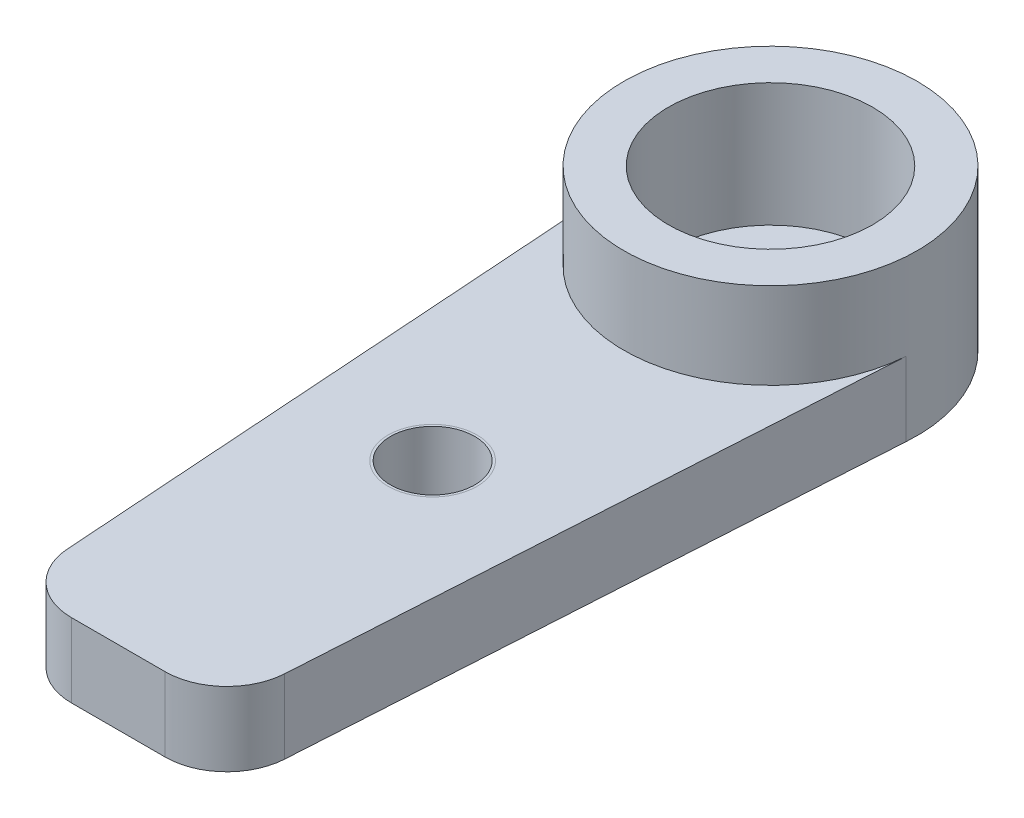
ISO-10303-21;
HEADER;
FILE_DESCRIPTION(('STEP AP214'),'2;1');
FILE_NAME('part.step','',(''),(''),'','','');
FILE_SCHEMA(('AUTOMOTIVE_DESIGN { 1 0 10303 214 1 1 1 1 }'));
ENDSEC;
DATA;
#1=APPLICATION_CONTEXT('core data for automotive mechanical design processes');
#2=APPLICATION_PROTOCOL_DEFINITION('international standard','automotive_design',2000,#1);
#3=PRODUCT_CONTEXT('',#1,'mechanical');
#4=PRODUCT('Part','Part','',(#3));
#5=PRODUCT_RELATED_PRODUCT_CATEGORY('part','',(#4));
#6=PRODUCT_DEFINITION_FORMATION('','',#4);
#7=PRODUCT_DEFINITION_CONTEXT('part definition',#1,'design');
#8=PRODUCT_DEFINITION('design','',#6,#7);
#9=PRODUCT_DEFINITION_SHAPE('','',#8);
#10=(LENGTH_UNIT() NAMED_UNIT(*) SI_UNIT(.MILLI.,.METRE.));
#11=(NAMED_UNIT(*) PLANE_ANGLE_UNIT() SI_UNIT($,.RADIAN.));
#12=(NAMED_UNIT(*) SI_UNIT($,.STERADIAN.) SOLID_ANGLE_UNIT());
#13=UNCERTAINTY_MEASURE_WITH_UNIT(LENGTH_MEASURE(1.E-05),#10,'distance_accuracy_value','');
#14=(GEOMETRIC_REPRESENTATION_CONTEXT(3) GLOBAL_UNCERTAINTY_ASSIGNED_CONTEXT((#13)) GLOBAL_UNIT_ASSIGNED_CONTEXT((#10,
#11,#12)) REPRESENTATION_CONTEXT('',''));
#15=CARTESIAN_POINT('',(0.,0.,0.));
#16=DIRECTION('',(0.,0.,1.));
#17=DIRECTION('',(1.,0.,0.));
#18=AXIS2_PLACEMENT_3D('',#15,#16,#17);
#19=CARTESIAN_POINT('',(39.1996121200788,-327.369804972376,6.04898215260297));
#20=DIRECTION('',(0.,-1.,0.));
#21=DIRECTION('',(0.,0.,-1.));
#22=AXIS2_PLACEMENT_3D('',#19,#20,#21);
#23=CYLINDRICAL_SURFACE('',#22,2.52355760551705);
#24=CARTESIAN_POINT('',(39.1996121200788,-327.369804972376,6.04898215260297));
#25=DIRECTION('',(0.,1.,0.));
#26=DIRECTION('',(1.,0.,0.));
#27=AXIS2_PLACEMENT_3D('',#24,#25,#26);
#28=CIRCLE('',#27,2.52355760551705);
#29=CARTESIAN_POINT('',(41.7231697255958,-327.369804972376,6.04898215260297));
#30=VERTEX_POINT('',#29);
#31=EDGE_CURVE('E153',#30,#30,#28,.T.);
#32=ORIENTED_EDGE('',*,*,#31,.T.);
#33=EDGE_LOOP('',(#32));
#34=FACE_BOUND('',#33,.T.);
#35=CARTESIAN_POINT('',(39.1996121200788,-330.420852972375,6.04898215260296));
#36=DIRECTION('',(0.,-1.,0.));
#37=DIRECTION('',(0.,0.,-1.));
#38=AXIS2_PLACEMENT_3D('',#35,#36,#37);
#39=CIRCLE('',#38,2.52355760551705);
#40=CARTESIAN_POINT('',(39.1996121200788,-330.420852972375,3.52542454708591));
#41=VERTEX_POINT('',#40);
#42=EDGE_CURVE('E53',#41,#41,#39,.T.);
#43=ORIENTED_EDGE('',*,*,#42,.T.);
#44=EDGE_LOOP('',(#43));
#45=FACE_BOUND('',#44,.T.);
#46=ADVANCED_FACE('F49',(#34,#45),#23,.F.);
#47=CARTESIAN_POINT('',(39.1996121200802,-327.369804972375,6.04898215260312));
#48=DIRECTION('',(0.,-1.,0.));
#49=DIRECTION('',(0.,0.,-1.));
#50=AXIS2_PLACEMENT_3D('',#47,#48,#49);
#51=PLANE('',#50);
#52=ORIENTED_EDGE('',*,*,#31,.F.);
#53=EDGE_LOOP('',(#52));
#54=FACE_BOUND('',#53,.T.);
#55=CARTESIAN_POINT('',(39.1996121200802,-327.369804972375,6.04898215260311));
#56=DIRECTION('',(0.,-1.,0.));
#57=DIRECTION('',(0.,0.,-1.));
#58=AXIS2_PLACEMENT_3D('',#55,#56,#57);
#59=CIRCLE('',#58,3.62892633808709);
#60=CARTESIAN_POINT('',(39.1996121200802,-327.369804972375,2.42005581451602));
#61=VERTEX_POINT('',#60);
#62=EDGE_CURVE('E115',#61,#61,#59,.T.);
#63=ORIENTED_EDGE('',*,*,#62,.F.);
#64=EDGE_LOOP('',(#63));
#65=FACE_BOUND('',#64,.T.);
#66=ADVANCED_FACE('F158',(#54,#65),#51,.F.);
#67=CARTESIAN_POINT('',(39.1996121200788,-329.50340497237,14.2271819651617));
#68=DIRECTION('',(0.,-1.,0.));
#69=DIRECTION('',(0.,0.,-1.));
#70=AXIS2_PLACEMENT_3D('',#67,#68,#69);
#71=PLANE('',#70);
#72=CARTESIAN_POINT('',(38.0996121200802,-329.50340497237,14.4055821526031));
#73=CARTESIAN_POINT('',(38.0996109327884,-329.50340497237,14.3881487705209));
#74=CARTESIAN_POINT('',(38.1000109436844,-329.50340497237,14.3707145814438));
#75=CARTESIAN_POINT('',(38.1016211900691,-329.50340497237,14.3360056273951));
#76=CARTESIAN_POINT('',(38.1028257566217,-329.50340497237,14.3187305984356));
#77=CARTESIAN_POINT('',(38.1060448257122,-329.50340497237,14.2843397611255));
#78=CARTESIAN_POINT('',(38.1080554015894,-329.50340497237,14.2672235866262));
#79=CARTESIAN_POINT('',(38.1128843312278,-329.50340497237,14.2331506604044));
#80=CARTESIAN_POINT('',(38.1157005826933,-329.50340497237,14.2161936108827));
#81=CARTESIAN_POINT('',(38.1221390672946,-329.50340497237,14.1824387815991));
#82=CARTESIAN_POINT('',(38.1257610436664,-329.50340497237,14.1656409528717));
#83=CARTESIAN_POINT('',(38.1338092506897,-329.50340497237,14.132204373158));
#84=CARTESIAN_POINT('',(38.1382370429588,-329.50340497237,14.115565998265));
#85=CARTESIAN_POINT('',(38.1478944835488,-329.50340497237,14.0824475626096));
#86=CARTESIAN_POINT('',(38.1531274328146,-329.50340497237,14.0659684646591));
#87=CARTESIAN_POINT('',(38.1643956873405,-329.50340497237,14.0331691094664));
#88=CARTESIAN_POINT('',(38.1704359272859,-329.50340497237,14.0168505508094));
#89=CARTESIAN_POINT('',(38.1838204631289,-329.50340497237,13.9830761120141));
#90=CARTESIAN_POINT('',(38.1912328302821,-329.50340497237,13.9656471745362));
#91=CARTESIAN_POINT('',(38.2068627657328,-329.50340497237,13.9313299401746));
#92=CARTESIAN_POINT('',(38.2150730716787,-329.50340497237,13.9144383382011));
#93=CARTESIAN_POINT('',(38.2322991946132,-329.50340497237,13.8811962763917));
#94=CARTESIAN_POINT('',(38.2413100021961,-329.50340497237,13.8648432227855));
#95=CARTESIAN_POINT('',(38.260134128874,-329.50340497237,13.832677219789));
#96=CARTESIAN_POINT('',(38.2699447319039,-329.50340497237,13.8168626813826));
#97=CARTESIAN_POINT('',(38.2903662819333,-329.50340497237,13.7857726822563));
#98=CARTESIAN_POINT('',(38.300976742761,-329.50340497237,13.7704969022248));
#99=CARTESIAN_POINT('',(38.3229958300074,-329.50340497237,13.7404831924122));
#100=CARTESIAN_POINT('',(38.3344060673546,-329.50340497237,13.7257464447767));
#101=CARTESIAN_POINT('',(38.358022258654,-329.50340497237,13.696808824077));
#102=CARTESIAN_POINT('',(38.3702317197532,-329.50340497237,13.6826108141148));
#103=CARTESIAN_POINT('',(38.395445961595,-329.50340497237,13.6547505941438));
#104=CARTESIAN_POINT('',(38.4084559056191,-329.50340497237,13.6410930618342));
#105=CARTESIAN_POINT('',(38.4351880499014,-329.50340497237,13.6143817333335));
#106=CARTESIAN_POINT('',(38.448912949219,-329.50340497237,13.6013306390967));
#107=CARTESIAN_POINT('',(38.4768873202677,-329.50340497237,13.5760445221078));
#108=CARTESIAN_POINT('',(38.4911314380942,-329.50340497237,13.5638035818023));
#109=CARTESIAN_POINT('',(38.520143837401,-329.50340497237,13.540138131461));
#110=CARTESIAN_POINT('',(38.5349085533762,-329.50340497237,13.5287092528504));
#111=CARTESIAN_POINT('',(38.5649599388324,-329.50340497237,13.5066658373304));
#112=CARTESIAN_POINT('',(38.5802447472109,-329.50340497237,13.4960487639931));
#113=CARTESIAN_POINT('',(38.6113347052217,-329.50340497237,13.4756271589275));
#114=CARTESIAN_POINT('',(38.6271395355331,-329.50340497237,13.4658221411007));
#115=CARTESIAN_POINT('',(38.6592680226993,-329.50340497237,13.4470225923899));
#116=CARTESIAN_POINT('',(38.6755926880767,-329.50340497237,13.4380297854961));
#117=CARTESIAN_POINT('',(38.708759428114,-329.50340497237,13.4208521264038));
#118=CARTESIAN_POINT('',(38.7256035838084,-329.50340497237,13.4126712943663));
#119=CARTESIAN_POINT('',(38.7598087915244,-329.50340497237,13.3971164050289));
#120=CARTESIAN_POINT('',(38.7771727223897,-329.50340497237,13.3897486838337));
#121=CARTESIAN_POINT('',(38.8109380327093,-329.50340497237,13.3763974227537));
#122=CARTESIAN_POINT('',(38.8273148637813,-329.50340497237,13.370351674503));
#123=CARTESIAN_POINT('',(38.86021349044,-329.50340497237,13.3590724093512));
#124=CARTESIAN_POINT('',(38.8767333697244,-329.50340497237,13.3538333130274));
#125=CARTESIAN_POINT('',(38.9099174137878,-329.50340497237,13.3441670813038));
#126=CARTESIAN_POINT('',(38.9265804070002,-329.50340497237,13.33973592657));
#127=CARTESIAN_POINT('',(38.9600498943862,-329.50340497237,13.3316836511385));
#128=CARTESIAN_POINT('',(38.9768558311909,-329.50340497237,13.3280602150809));
#129=CARTESIAN_POINT('',(39.0106106220686,-329.50340497237,13.3216216788229));
#130=CARTESIAN_POINT('',(39.0275593768567,-329.50340497237,13.318806058209));
#131=CARTESIAN_POINT('',(39.0615993612196,-329.50340497237,13.3139814524444));
#132=CARTESIAN_POINT('',(39.0786907777389,-329.50340497237,13.3119737871768));
#133=CARTESIAN_POINT('',(39.1130158530397,-329.50340497237,13.3087627109405));
#134=CARTESIAN_POINT('',(39.1302498064472,-329.50340497237,13.3075624530191));
#135=CARTESIAN_POINT('',(39.1648597991339,-329.50340497237,13.3059663781255));
#136=CARTESIAN_POINT('',(39.1822360644362,-329.50340497237,13.3055755059863));
#137=CARTESIAN_POINT('',(39.2170647926234,-329.50340497237,13.3055888285271));
#138=CARTESIAN_POINT('',(39.2345172536554,-329.50340497237,13.3059965365249));
#139=CARTESIAN_POINT('',(39.269257866268,-329.50340497237,13.3076197567019));
#140=CARTESIAN_POINT('',(39.2865462907721,-329.50340497237,13.3088293819495));
#141=CARTESIAN_POINT('',(39.3209584591156,-329.50340497237,13.3120568225915));
#142=CARTESIAN_POINT('',(39.33808259293,-329.50340497237,13.3140704693784));
#143=CARTESIAN_POINT('',(39.372166115099,-329.50340497237,13.3189036416929));
#144=CARTESIAN_POINT('',(39.3891258374817,-329.50340497237,13.3217208097329));
#145=CARTESIAN_POINT('',(39.4228806390907,-329.50340497237,13.3281592798126));
#146=CARTESIAN_POINT('',(39.4396758175678,-329.50340497237,13.3317800613829));
#147=CARTESIAN_POINT('',(39.4731017104032,-329.50340497237,13.3398240497159));
#148=CARTESIAN_POINT('',(39.4897321128022,-329.50340497237,13.3442485521407));
#149=CARTESIAN_POINT('',(39.5228292356902,-329.50340497237,13.3538974954216));
#150=CARTESIAN_POINT('',(39.5392950701185,-329.50340497237,13.3591249750362));
#151=CARTESIAN_POINT('',(39.572062387547,-329.50340497237,13.3703807086187));
#152=CARTESIAN_POINT('',(39.5883622587664,-329.50340497237,13.3764136458171));
#153=CARTESIAN_POINT('',(39.6221182880985,-329.50340497237,13.3897901756882));
#154=CARTESIAN_POINT('',(39.6395471321508,-329.50340497237,13.397202777423));
#155=CARTESIAN_POINT('',(39.6738642987879,-329.50340497237,13.412832882922));
#156=CARTESIAN_POINT('',(39.6907559254713,-329.50340497237,13.4210431268229));
#157=CARTESIAN_POINT('',(39.7239980052464,-329.50340497237,13.4382692046462));
#158=CARTESIAN_POINT('',(39.7403510522922,-329.50340497237,13.4472800287015));
#159=CARTESIAN_POINT('',(39.7725170505038,-329.50340497237,13.4661041673932));
#160=CARTESIAN_POINT('',(39.7883315906587,-329.50340497237,13.4759147660326));
#161=CARTESIAN_POINT('',(39.8194215910643,-329.50340497237,13.4963363128497));
#162=CARTESIAN_POINT('',(39.8346973706279,-329.50340497237,13.5069467748523));
#163=CARTESIAN_POINT('',(39.8647110800972,-329.50340497237,13.5289658629611));
#164=CARTESIAN_POINT('',(39.8794478278587,-329.50340497237,13.5403760999927));
#165=CARTESIAN_POINT('',(39.9083854486513,-329.50340497237,13.5639922910598));
#166=CARTESIAN_POINT('',(39.9225834585798,-329.50340497237,13.5762017522443));
#167=CARTESIAN_POINT('',(39.9504436785263,-329.50340497237,13.6014159941492));
#168=CARTESIAN_POINT('',(39.9641012108454,-329.50340497237,13.6144259381504));
#169=CARTESIAN_POINT('',(39.9908125393529,-329.50340497237,13.6411580824153));
#170=CARTESIAN_POINT('',(40.0038636335869,-329.50340497237,13.6548829817387));
#171=CARTESIAN_POINT('',(40.0291497505736,-329.50340497237,13.6828573527911));
#172=CARTESIAN_POINT('',(40.0413906908796,-329.50340497237,13.6971014706156));
#173=CARTESIAN_POINT('',(40.065056141221,-329.50340497237,13.7261138699207));
#174=CARTESIAN_POINT('',(40.0764850198313,-329.50340497237,13.7408785858961));
#175=CARTESIAN_POINT('',(40.098528435351,-329.50340497237,13.7709299713524));
#176=CARTESIAN_POINT('',(40.1091455086883,-329.50340497237,13.7862147797307));
#177=CARTESIAN_POINT('',(40.129567113754,-329.50340497237,13.8173047377415));
#178=CARTESIAN_POINT('',(40.1393721315807,-329.50340497237,13.8331095680529));
#179=CARTESIAN_POINT('',(40.1581716802917,-329.50340497237,13.8652380552195));
#180=CARTESIAN_POINT('',(40.1671644871856,-329.50340497237,13.881562720597));
#181=CARTESIAN_POINT('',(40.1843421462783,-329.50340497237,13.9147294606348));
#182=CARTESIAN_POINT('',(40.192522978316,-329.50340497237,13.9315736163296));
#183=CARTESIAN_POINT('',(40.2080778676538,-329.50340497237,13.9657788240464));
#184=CARTESIAN_POINT('',(40.2154455888493,-329.50340497237,13.9831427549121));
#185=CARTESIAN_POINT('',(40.2287968499296,-329.50340497237,14.0169080652322));
#186=CARTESIAN_POINT('',(40.2348425981804,-329.50340497237,14.0332848963042));
#187=CARTESIAN_POINT('',(40.2461218633324,-329.50340497237,14.0661835229628));
#188=CARTESIAN_POINT('',(40.2513609596563,-329.50340497237,14.0827034022472));
#189=CARTESIAN_POINT('',(40.2610271913799,-329.50340497237,14.1158874463105));
#190=CARTESIAN_POINT('',(40.2654583461137,-329.50340497237,14.1325504395229));
#191=CARTESIAN_POINT('',(40.2735106215453,-329.50340497237,14.1660199269089));
#192=CARTESIAN_POINT('',(40.2771340576029,-329.50340497237,14.1828258637136));
#193=CARTESIAN_POINT('',(40.2835725938609,-329.50340497237,14.2165806545913));
#194=CARTESIAN_POINT('',(40.2863882144748,-329.50340497237,14.2335294093794));
#195=CARTESIAN_POINT('',(40.2912128202394,-329.50340497237,14.2675693937423));
#196=CARTESIAN_POINT('',(40.293220485507,-329.50340497237,14.2846608102616));
#197=CARTESIAN_POINT('',(40.2964315617431,-329.50340497237,14.3189858855624));
#198=CARTESIAN_POINT('',(40.2976318196645,-329.50340497237,14.3362198389699));
#199=CARTESIAN_POINT('',(40.2992278945579,-329.50340497237,14.3708298316568));
#200=CARTESIAN_POINT('',(40.2996187666971,-329.50340497237,14.3882060969591));
#201=CARTESIAN_POINT('',(40.2996054441561,-329.50340497237,14.423034825146));
#202=CARTESIAN_POINT('',(40.2991977361582,-329.50340497237,14.4404872861777));
#203=CARTESIAN_POINT('',(40.2975745159812,-329.50340497237,14.4752278987897));
#204=CARTESIAN_POINT('',(40.2963648907334,-329.50340497237,14.4925163232936));
#205=CARTESIAN_POINT('',(40.2931374500914,-329.50340497237,14.5269284916368));
#206=CARTESIAN_POINT('',(40.2911238033044,-329.50340497237,14.544052625451));
#207=CARTESIAN_POINT('',(40.2862906309899,-329.50340497237,14.5781361476198));
#208=CARTESIAN_POINT('',(40.2834734629499,-329.50340497237,14.5950958700024));
#209=CARTESIAN_POINT('',(40.2770349928702,-329.50340497237,14.6288506716115));
#210=CARTESIAN_POINT('',(40.2734142112999,-329.50340497237,14.6456458500887));
#211=CARTESIAN_POINT('',(40.2653702229669,-329.50340497237,14.6790717429242));
#212=CARTESIAN_POINT('',(40.2609457205422,-329.50340497237,14.6957021453234));
#213=CARTESIAN_POINT('',(40.2512967772613,-329.50340497237,14.7287992682116));
#214=CARTESIAN_POINT('',(40.2460692976468,-329.50340497237,14.7452651026402));
#215=CARTESIAN_POINT('',(40.2348135640644,-329.50340497237,14.7780324200693));
#216=CARTESIAN_POINT('',(40.2287806268661,-329.50340497237,14.7943322912889));
#217=CARTESIAN_POINT('',(40.2154040969955,-329.50340497237,14.828088320621));
#218=CARTESIAN_POINT('',(40.2079914952611,-329.50340497237,14.8455171646729));
#219=CARTESIAN_POINT('',(40.1923613897627,-329.50340497237,14.8798343313093));
#220=CARTESIAN_POINT('',(40.1841511458621,-329.50340497237,14.8967259579924));
#221=CARTESIAN_POINT('',(40.1669250680393,-329.50340497237,14.9299680377671));
#222=CARTESIAN_POINT('',(40.157914243984,-329.50340497237,14.9463210848126));
#223=CARTESIAN_POINT('',(40.1390901052926,-329.50340497237,14.978487083024));
#224=CARTESIAN_POINT('',(40.1292795066533,-329.50340497237,14.9943016231789));
#225=CARTESIAN_POINT('',(40.1088579598361,-329.50340497237,15.0253916235845));
#226=CARTESIAN_POINT('',(40.0982474978335,-329.50340497237,15.0406674031482));
#227=CARTESIAN_POINT('',(40.0762284097245,-329.50340497237,15.0706811126177));
#228=CARTESIAN_POINT('',(40.0648181726927,-329.50340497237,15.0854178603793));
#229=CARTESIAN_POINT('',(40.0412019816251,-329.50340497237,15.1143554811724));
#230=CARTESIAN_POINT('',(40.0289925204404,-329.50340497237,15.1285534911012));
#231=CARTESIAN_POINT('',(40.0037782785349,-329.50340497237,15.1564137110484));
#232=CARTESIAN_POINT('',(39.9907683345333,-329.50340497237,15.1700712433679));
#233=CARTESIAN_POINT('',(39.964036190268,-329.50340497237,15.1967825718758));
#234=CARTESIAN_POINT('',(39.9503112909446,-329.50340497237,15.2098336661098));
#235=CARTESIAN_POINT('',(39.9223369198923,-329.50340497237,15.2351197830965));
#236=CARTESIAN_POINT('',(39.9080928020678,-329.50340497237,15.2473607234025));
#237=CARTESIAN_POINT('',(39.8790804027628,-329.50340497237,15.2710261737439));
#238=CARTESIAN_POINT('',(39.8643156867873,-329.50340497237,15.2824550523542));
#239=CARTESIAN_POINT('',(39.8342643013311,-329.50340497237,15.304498467874));
#240=CARTESIAN_POINT('',(39.8189794929528,-329.50340497237,15.3151155412112));
#241=CARTESIAN_POINT('',(39.787889534942,-329.50340497237,15.3355371462769));
#242=CARTESIAN_POINT('',(39.7720847046306,-329.50340497237,15.3453421641036));
#243=CARTESIAN_POINT('',(39.739956217464,-329.50340497237,15.3641417128146));
#244=CARTESIAN_POINT('',(39.7236315520865,-329.50340497237,15.3731345197085));
#245=CARTESIAN_POINT('',(39.6904648120486,-329.50340497237,15.3903121788012));
#246=CARTESIAN_POINT('',(39.6736206563538,-329.50340497237,15.3984930108389));
#247=CARTESIAN_POINT('',(39.639415448637,-329.50340497237,15.4140479001767));
#248=CARTESIAN_POINT('',(39.6220515177712,-329.50340497237,15.4214156213722));
#249=CARTESIAN_POINT('',(39.5882862074513,-329.50340497237,15.4347668824525));
#250=CARTESIAN_POINT('',(39.5719093763795,-329.50340497237,15.4408126307032));
#251=CARTESIAN_POINT('',(39.5390107497212,-329.50340497237,15.4520918958551));
#252=CARTESIAN_POINT('',(39.5224908704368,-329.50340497237,15.4573309921788));
#253=CARTESIAN_POINT('',(39.4893068263737,-329.50340497237,15.4669972239024));
#254=CARTESIAN_POINT('',(39.4726438331614,-329.50340497237,15.4714283786362));
#255=CARTESIAN_POINT('',(39.4391743457754,-329.50340497237,15.4794806540677));
#256=CARTESIAN_POINT('',(39.4223684089708,-329.50340497237,15.4831040901253));
#257=CARTESIAN_POINT('',(39.3886136180931,-329.50340497237,15.4895426263833));
#258=CARTESIAN_POINT('',(39.371664863305,-329.50340497237,15.4923582469972));
#259=CARTESIAN_POINT('',(39.337624878942,-329.50340497237,15.4971828527618));
#260=CARTESIAN_POINT('',(39.3205334624226,-329.50340497237,15.4991905180294));
#261=CARTESIAN_POINT('',(39.2862083871216,-329.50340497237,15.5024015942657));
#262=CARTESIAN_POINT('',(39.268974433714,-329.50340497237,15.5036018521871));
#263=CARTESIAN_POINT('',(39.2343644410268,-329.50340497237,15.5051979270807));
#264=CARTESIAN_POINT('',(39.2169881757244,-329.50340497237,15.50558879922));
#265=CARTESIAN_POINT('',(39.1821594475369,-329.50340497237,15.5055754766791));
#266=CARTESIAN_POINT('',(39.1647069865048,-329.50340497237,15.5051677686813));
#267=CARTESIAN_POINT('',(39.1299663738921,-329.50340497237,15.5035445485043));
#268=CARTESIAN_POINT('',(39.112677949388,-329.50340497237,15.5023349232567));
#269=CARTESIAN_POINT('',(39.0782657810444,-329.50340497237,15.4991074826147));
#270=CARTESIAN_POINT('',(39.06114164723,-329.50340497237,15.4970938358278));
#271=CARTESIAN_POINT('',(39.0270581250609,-329.50340497237,15.4922606635133));
#272=CARTESIAN_POINT('',(39.0100984026782,-329.50340497237,15.4894434954733));
#273=CARTESIAN_POINT('',(38.9763436010691,-329.50340497237,15.4830050253936));
#274=CARTESIAN_POINT('',(38.9595484225921,-329.50340497237,15.4793842438233));
#275=CARTESIAN_POINT('',(38.9261225297567,-329.50340497237,15.4713402554903));
#276=CARTESIAN_POINT('',(38.9094921273577,-329.50340497237,15.4669157530655));
#277=CARTESIAN_POINT('',(38.8763950044699,-329.50340497237,15.4572668097846));
#278=CARTESIAN_POINT('',(38.8599291700416,-329.50340497237,15.45203933017));
#279=CARTESIAN_POINT('',(38.8271618526132,-329.50340497237,15.4407835965875));
#280=CARTESIAN_POINT('',(38.810861981394,-329.50340497237,15.4347506593891));
#281=CARTESIAN_POINT('',(38.7771059520615,-329.50340497237,15.4213741295178));
#282=CARTESIAN_POINT('',(38.7596771080088,-329.50340497237,15.4139615277829));
#283=CARTESIAN_POINT('',(38.7253599413711,-329.50340497237,15.3983314222835));
#284=CARTESIAN_POINT('',(38.7084683146875,-329.50340497237,15.3901211783825));
#285=CARTESIAN_POINT('',(38.675226234912,-329.50340497237,15.3728951005591));
#286=CARTESIAN_POINT('',(38.658873187866,-329.50340497237,15.3638842765036));
#287=CARTESIAN_POINT('',(38.6267071896542,-329.50340497237,15.3450601378119));
#288=CARTESIAN_POINT('',(38.6108926494992,-329.50340497237,15.3352495391725));
#289=CARTESIAN_POINT('',(38.5798026490937,-329.50340497237,15.3148279923553));
#290=CARTESIAN_POINT('',(38.5645268695303,-329.50340497237,15.3042175303527));
#291=CARTESIAN_POINT('',(38.5345131600608,-329.50340497237,15.2821984422441));
#292=CARTESIAN_POINT('',(38.5197764122991,-329.50340497237,15.2707882052128));
#293=CARTESIAN_POINT('',(38.4908387915081,-329.50340497237,15.2471720141454));
#294=CARTESIAN_POINT('',(38.4766407815815,-329.50340497237,15.2349625529604));
#295=CARTESIAN_POINT('',(38.4487805616311,-329.50340497237,15.2097483110575));
#296=CARTESIAN_POINT('',(38.4351230293062,-329.50340497237,15.196738367059));
#297=CARTESIAN_POINT('',(38.4084117008156,-329.50340497237,15.1700062227871));
#298=CARTESIAN_POINT('',(38.3953606066044,-329.50340497237,15.1562813234541));
#299=CARTESIAN_POINT('',(38.3700744895547,-329.50340497237,15.1283069524258));
#300=CARTESIAN_POINT('',(38.3578335491639,-329.50340497237,15.1140628346346));
#301=CARTESIAN_POINT('',(38.3341680990531,-329.50340497237,15.0850504352374));
#302=CARTESIAN_POINT('',(38.322739220756,-329.50340497237,15.0702857191373));
#303=CARTESIAN_POINT('',(38.3006958043807,-329.50340497237,15.0402343340205));
#304=CARTESIAN_POINT('',(38.2900787298795,-329.50340497237,15.0249495261041));
#305=CARTESIAN_POINT('',(38.2696571279946,-329.50340497237,14.9938595668306));
#306=CARTESIAN_POINT('',(38.2598521145091,-329.50340497237,14.9780547347959));
#307=CARTESIAN_POINT('',(38.2410525539238,-329.50340497237,14.9459262523435));
#308=CARTESIAN_POINT('',(38.2320597307717,-329.50340497237,14.9296015934205));
#309=CARTESIAN_POINT('',(38.2148821161876,-329.50340497237,14.896434835714));
#310=CARTESIAN_POINT('',(38.2067013452812,-329.50340497237,14.8795906557515));
#311=CARTESIAN_POINT('',(38.1911462884583,-329.50340497237,14.8453855145246));
#312=CARTESIAN_POINT('',(38.1837783365247,-329.50340497237,14.8280216752589));
#313=CARTESIAN_POINT('',(38.1704350402147,-329.50340497237,14.7942747352386));
#314=CARTESIAN_POINT('',(38.1643965559165,-329.50340497237,14.7779165506603));
#315=CARTESIAN_POINT('',(38.1531297485045,-329.50340497237,14.745049889709));
#316=CARTESIAN_POINT('',(38.1478960934632,-329.50340497237,14.7285432443568));
#317=CARTESIAN_POINT('',(38.1382383183738,-329.50340497237,14.6953804659585));
#318=CARTESIAN_POINT('',(38.1338104394294,-329.50340497237,14.6787254282174));
#319=CARTESIAN_POINT('',(38.1257623552459,-329.50340497237,14.6452666010829));
#320=CARTESIAN_POINT('',(38.1221400995145,-329.50340497237,14.628463305186));
#321=CARTESIAN_POINT('',(38.1157016018877,-329.50340497237,14.594708550704));
#322=CARTESIAN_POINT('',(38.1128851033119,-329.50340497237,14.5777571410791));
#323=CARTESIAN_POINT('',(38.1080561855005,-329.50340497237,14.5437065509498));
#324=CARTESIAN_POINT('',(38.1060453422567,-329.50340497237,14.5266071470181));
#325=CARTESIAN_POINT('',(38.1028262748225,-329.50340497237,14.4922609140716));
#326=CARTESIAN_POINT('',(38.1016214498482,-329.50340497237,14.4750137675399));
#327=CARTESIAN_POINT('',(38.1000111933788,-329.50340497237,14.4403717157059));
#328=CARTESIAN_POINT('',(38.0996109148241,-329.50340497237,14.4229765700722));
#329=CARTESIAN_POINT('',(38.0996121200802,-329.50340497237,14.4055821526031));
#330=B_SPLINE_CURVE_WITH_KNOTS('',3,(#72,#73,#74,#75,#76,#77,#78,#79,#80,#81,#82,#83,#84,#85,
#86,#87,#88,#89,#90,#91,#92,#93,#94,#95,#96,#97,#98,#99,#100,#101,#102,#103,#104,#105,#106,#107,
#108,#109,#110,#111,#112,#113,#114,#115,#116,#117,#118,#119,#120,#121,#122,#123,#124,#125,#126,
#127,#128,#129,#130,#131,#132,#133,#134,#135,#136,#137,#138,#139,#140,#141,#142,#143,#144,#145,
#146,#147,#148,#149,#150,#151,#152,#153,#154,#155,#156,#157,#158,#159,#160,#161,#162,#163,#164,
#165,#166,#167,#168,#169,#170,#171,#172,#173,#174,#175,#176,#177,#178,#179,#180,#181,#182,#183,
#184,#185,#186,#187,#188,#189,#190,#191,#192,#193,#194,#195,#196,#197,#198,#199,#200,#201,#202,
#203,#204,#205,#206,#207,#208,#209,#210,#211,#212,#213,#214,#215,#216,#217,#218,#219,#220,#221,
#222,#223,#224,#225,#226,#227,#228,#229,#230,#231,#232,#233,#234,#235,#236,#237,#238,#239,#240,
#241,#242,#243,#244,#245,#246,#247,#248,#249,#250,#251,#252,#253,#254,#255,#256,#257,#258,#259,
#260,#261,#262,#263,#264,#265,#266,#267,#268,#269,#270,#271,#272,#273,#274,#275,#276,#277,#278,
#279,#280,#281,#282,#283,#284,#285,#286,#287,#288,#289,#290,#291,#292,#293,#294,#295,#296,#297,
#298,#299,#300,#301,#302,#303,#304,#305,#306,#307,#308,#309,#310,#311,#312,#313,#314,#315,#316,
#317,#318,#319,#320,#321,#322,#323,#324,#325,#326,#327,#328,#329),.UNSPECIFIED.,.F.,.F.,(4,2,2,
2,2,2,2,2,2,2,2,2,2,2,2,2,2,2,2,2,2,2,2,2,2,2,2,2,2,2,2,2,2,2,2,2,2,2,2,2,2,2,2,2,2,2,2,2,2,2,2,
2,2,2,2,2,2,2,2,2,2,2,2,2,2,2,2,2,2,2,2,2,2,2,2,2,2,2,2,2,2,2,2,2,2,2,2,2,2,2,2,2,2,2,2,2,2,2,2,
2,2,2,2,2,2,2,2,2,2,2,2,2,2,2,2,2,2,2,2,2,2,2,2,2,2,2,2,2,4),(0.,0.0522966891070737,
0.104228726834629,0.155910781841791,0.20745919106305,0.258991196583642,0.310624152231737,
0.3624747263963,0.414658127873047,0.471453333292767,0.527772947069813,0.583762079984033,
0.63956842087949,0.695341110746102,0.751229559972549,0.807382254921948,0.863945600954396,
0.920740623791906,0.97706014357761,1.0330492424125,1.08885557948514,1.14462826559814,
1.20051668089794,1.25666928193173,1.31323244512711,1.3655856836601,1.41755874518485,
1.46926574343294,1.5208225588467,1.57234608519727,1.62395344246147,1.67576118207824,
1.72788451129669,1.78023766988183,1.83221069410763,1.88391768205827,1.93547449810706,
1.98699801974202,2.03860535066174,2.09041302625197,2.14253623814342,2.1993314435621,
2.25565105733841,2.31164019025219,2.3674465311475,2.42321922101425,2.47910767024112,
2.53526036519122,2.59182371122464,2.64861873406055,2.70493825384511,2.7609273526793,
2.81673368975171,2.87250637586494,2.92839479116545,2.9845473922004,3.0411105553974,
3.09346379393037,3.14543685545511,3.19714385370319,3.24870066911694,3.30022419546752,
3.35183155273175,3.40363929234858,3.45576262156711,3.5081157801513,3.56008880437645,
3.61179579232668,3.66335260837535,3.71487613001043,3.76648346093053,3.81829113652135,
3.87041434841361,3.92720955383073,3.9835291676059,4.03951830051899,4.09532464141407,
4.15109733128106,4.20698578050864,4.26313847545993,4.31970182149501,4.37649684433087,
4.43281636411538,4.48880546294955,4.54461180002196,4.60038448613519,4.65627290143572,
4.71242550247072,4.76898866566779,4.82134190420023,4.87331496572459,4.92502196397244,
4.97657877938611,5.02810230573676,5.07970966300121,5.13151740261841,5.18364073183744,
5.2359938904228,5.28796691464877,5.33967390259949,5.39123071864833,5.44275424028325,
5.49436157120288,5.54616924679295,5.59829245868419,5.65508766410409,5.71140727788126,
5.76739641079556,5.82320275169104,5.87897544155762,5.93486389078399,5.99101658573325,
6.0475799317655,6.1043749546029,6.16069447438853,6.21668357322338,6.272489910296,
6.32826259640902,6.38415101170887,6.44030361274273,6.49686677593821,6.54915998182426,
6.60109025529089,6.65277169348913,6.70432004591288,6.75585195886409,6.80748419006382,
6.85933281951877,6.91151248304293),.UNSPECIFIED.);
#331=CARTESIAN_POINT('',(38.0996121200802,-329.50340497237,14.4055821526031));
#332=VERTEX_POINT('',#331);
#333=EDGE_CURVE('E189',#332,#332,#330,.T.);
#334=ORIENTED_EDGE('',*,*,#333,.T.);
#335=EDGE_LOOP('',(#334));
#336=FACE_BOUND('',#335,.T.);
#337=DIRECTION('',(0.0684059350238423,0.,0.997657570538867));
#338=VECTOR('',#337,1.);
#339=CARTESIAN_POINT('',(35.5748012681271,-329.50340497237,6.22176136094463));
#340=LINE('',#339,#338);
#341=CARTESIAN_POINT('',(36.5752620582078,-329.50340497237,20.8128532143551));
#342=VERTEX_POINT('',#341);
#343=CARTESIAN_POINT('',(35.5851420688733,-329.50340497237,6.37257544083807));
#344=VERTEX_POINT('',#343);
#345=EDGE_CURVE('E107',#342,#344,#340,.F.);
#346=ORIENTED_EDGE('',*,*,#345,.F.);
#347=CARTESIAN_POINT('',(38.0956921957091,-329.50340497237,20.7086025693787));
#348=DIRECTION('',(0.,1.,0.));
#349=DIRECTION('',(0.,0.,1.));
#350=AXIS2_PLACEMENT_3D('',#347,#348,#349);
#351=CIRCLE('',#350,1.52400000000003);
#352=CARTESIAN_POINT('',(38.0956921957091,-329.50340497237,22.2326025693787));
#353=VERTEX_POINT('',#352);
#354=EDGE_CURVE('E124',#353,#342,#351,.F.);
#355=ORIENTED_EDGE('',*,*,#354,.F.);
#356=DIRECTION('',(1.,0.,0.));
#357=VECTOR('',#356,1.);
#358=CARTESIAN_POINT('',(38.0956921957091,-329.50340497237,22.2326025693787));
#359=LINE('',#358,#357);
#360=CARTESIAN_POINT('',(40.4130280551528,-329.50340497237,22.2326025693787));
#361=VERTEX_POINT('',#360);
#362=EDGE_CURVE('E141',#361,#353,#359,.F.);
#363=ORIENTED_EDGE('',*,*,#362,.F.);
#364=CARTESIAN_POINT('',(40.4130280551528,-329.50340497237,20.7086025693787));
#365=DIRECTION('',(0.,1.,0.));
#366=DIRECTION('',(0.,0.,1.));
#367=AXIS2_PLACEMENT_3D('',#364,#365,#366);
#368=CIRCLE('',#367,1.52400000000004);
#369=CARTESIAN_POINT('',(41.9341950551768,-329.50340497237,20.8014839886074));
#370=VERTEX_POINT('',#369);
#371=EDGE_CURVE('E224',#370,#361,#368,.F.);
#372=ORIENTED_EDGE('',*,*,#371,.F.);
#373=DIRECTION('',(0.0609458131421778,0.,-0.998141076131244));
#374=VECTOR('',#373,1.);
#375=CARTESIAN_POINT('',(41.9341950551768,-329.50340497237,20.8014839886074));
#376=LINE('',#375,#374);
#377=CARTESIAN_POINT('',(42.8185162232784,-329.50340497237,6.31849923762289));
#378=VERTEX_POINT('',#377);
#379=EDGE_CURVE('E109',#378,#370,#376,.F.);
#380=ORIENTED_EDGE('',*,*,#379,.F.);
#381=CARTESIAN_POINT('',(39.1996121200802,-329.50340497237,6.0489821526031));
#382=DIRECTION('',(0.,-1.,0.));
#383=DIRECTION('',(0.,0.,-1.));
#384=AXIS2_PLACEMENT_3D('',#381,#382,#383);
#385=CIRCLE('',#384,3.62892633808709);
#386=EDGE_CURVE('E102',#344,#378,#385,.F.);
#387=ORIENTED_EDGE('',*,*,#386,.F.);
#388=EDGE_LOOP('',(#346,#355,#363,#372,#380,#387));
#389=FACE_BOUND('',#388,.T.);
#390=ADVANCED_FACE('F104',(#336,#389),#71,.F.);
#391=CARTESIAN_POINT('',(39.1996121200802,-329.503204972375,14.4055821526031));
#392=DIRECTION('',(0.,-1.,0.));
#393=DIRECTION('',(0.,0.,-1.));
#394=AXIS2_PLACEMENT_3D('',#391,#392,#393);
#395=PLANE('',#394);
#396=CARTESIAN_POINT('',(39.1996121200801,-329.503204972375,14.4055821526031));
#397=DIRECTION('',(0.,-1.,0.));
#398=DIRECTION('',(0.,0.,-1.));
#399=AXIS2_PLACEMENT_3D('',#396,#397,#398);
#400=CIRCLE('',#399,1.0414);
#401=CARTESIAN_POINT('',(39.1996121200801,-329.503204972375,13.3641821526031));
#402=VERTEX_POINT('',#401);
#403=EDGE_CURVE('E195',#402,#402,#400,.T.);
#404=ORIENTED_EDGE('',*,*,#403,.T.);
#405=EDGE_LOOP('',(#404));
#406=FACE_BOUND('',#405,.T.);
#407=ORIENTED_EDGE('',*,*,#333,.F.);
#408=EDGE_LOOP('',(#407));
#409=FACE_BOUND('',#408,.T.);
#410=ADVANCED_FACE('F169',(#406,#409),#395,.F.);
#411=CARTESIAN_POINT('',(39.1996121200802,-330.420852972375,6.0489821526031));
#412=DIRECTION('',(0.,-1.,0.));
#413=DIRECTION('',(0.,0.,-1.));
#414=AXIS2_PLACEMENT_3D('',#411,#412,#413);
#415=PLANE('',#414);
#416=CARTESIAN_POINT('',(39.1996121200802,-330.420852972375,6.0489821526031));
#417=DIRECTION('',(0.,-1.,0.));
#418=DIRECTION('',(0.,0.,-1.));
#419=AXIS2_PLACEMENT_3D('',#416,#417,#418);
#420=CIRCLE('',#419,1.33598684819257);
#421=CARTESIAN_POINT('',(39.1996121200802,-330.420852972375,4.71299530441053));
#422=VERTEX_POINT('',#421);
#423=EDGE_CURVE('E128',#422,#422,#420,.T.);
#424=ORIENTED_EDGE('',*,*,#423,.T.);
#425=EDGE_LOOP('',(#424));
#426=FACE_BOUND('',#425,.T.);
#427=ORIENTED_EDGE('',*,*,#42,.F.);
#428=EDGE_LOOP('',(#427));
#429=FACE_BOUND('',#428,.T.);
#430=ADVANCED_FACE('F174',(#426,#429),#415,.F.);
#431=CARTESIAN_POINT('',(39.1996121200802,-330.417804972375,6.0489821526031));
#432=DIRECTION('',(0.,-1.,0.));
#433=DIRECTION('',(0.,0.,-1.));
#434=AXIS2_PLACEMENT_3D('',#431,#432,#433);
#435=CYLINDRICAL_SURFACE('',#434,3.62892633808709);
#436=ORIENTED_EDGE('',*,*,#62,.T.);
#437=EDGE_LOOP('',(#436));
#438=FACE_BOUND('',#437,.T.);
#439=DIRECTION('',(0.,1.,0.));
#440=VECTOR('',#439,1.);
#441=CARTESIAN_POINT('',(35.5851420688733,-331.33220497237,6.37257544083871));
#442=LINE('',#441,#440);
#443=CARTESIAN_POINT('',(35.5851420688732,-331.332204972375,6.37257544083697));
#444=VERTEX_POINT('',#443);
#445=EDGE_CURVE('E118',#344,#444,#442,.F.);
#446=ORIENTED_EDGE('',*,*,#445,.F.);
#447=ORIENTED_EDGE('',*,*,#386,.T.);
#448=DIRECTION('',(0.,1.,0.));
#449=VECTOR('',#448,1.);
#450=CARTESIAN_POINT('',(42.8185162232785,-331.33220497237,6.31849923762097));
#451=LINE('',#450,#449);
#452=CARTESIAN_POINT('',(42.8185162232785,-331.332204972372,6.31849923762163));
#453=VERTEX_POINT('',#452);
#454=EDGE_CURVE('E114',#453,#378,#451,.T.);
#455=ORIENTED_EDGE('',*,*,#454,.F.);
#456=CARTESIAN_POINT('',(39.1996121200802,-331.332204972375,6.0489821526031));
#457=DIRECTION('',(0.,-1.,0.));
#458=DIRECTION('',(0.,0.,-1.));
#459=AXIS2_PLACEMENT_3D('',#456,#457,#458);
#460=CIRCLE('',#459,3.62892633808709);
#461=EDGE_CURVE('E120',#444,#453,#460,.T.);
#462=ORIENTED_EDGE('',*,*,#461,.F.);
#463=EDGE_LOOP('',(#446,#447,#455,#462));
#464=FACE_BOUND('',#463,.T.);
#465=ADVANCED_FACE('F119',(#438,#464),#435,.T.);
#466=CARTESIAN_POINT('',(41.9341950551768,-331.33220497237,20.8014839886074));
#467=DIRECTION('',(0.998141076131244,0.,0.0609458131421778));
#468=DIRECTION('',(0.0609458131421778,0.,-0.998141076131244));
#469=AXIS2_PLACEMENT_3D('',#466,#467,#468);
#470=PLANE('',#469);
#471=DIRECTION('',(0.,1.,0.));
#472=VECTOR('',#471,1.);
#473=CARTESIAN_POINT('',(41.9341950551769,-331.33220497237,20.8014839886074));
#474=LINE('',#473,#472);
#475=CARTESIAN_POINT('',(41.9341950551768,-331.332204972372,20.8014839886074));
#476=VERTEX_POINT('',#475);
#477=EDGE_CURVE('E148',#476,#370,#474,.T.);
#478=ORIENTED_EDGE('',*,*,#477,.F.);
#479=DIRECTION('',(-0.0609458131421805,0.,0.998141076131244));
#480=VECTOR('',#479,1.);
#481=CARTESIAN_POINT('',(42.8185162232785,-331.332204972375,6.31849923762097));
#482=LINE('',#481,#480);
#483=EDGE_CURVE('E214',#453,#476,#482,.T.);
#484=ORIENTED_EDGE('',*,*,#483,.F.);
#485=ORIENTED_EDGE('',*,*,#454,.T.);
#486=ORIENTED_EDGE('',*,*,#379,.T.);
#487=EDGE_LOOP('',(#478,#484,#485,#486));
#488=FACE_BOUND('',#487,.T.);
#489=ADVANCED_FACE('F230',(#488),#470,.T.);
#490=CARTESIAN_POINT('',(40.4130280551528,-331.33220497237,20.7086025693787));
#491=DIRECTION('',(0.,1.,0.));
#492=DIRECTION('',(0.,0.,1.));
#493=AXIS2_PLACEMENT_3D('',#490,#491,#492);
#494=CYLINDRICAL_SURFACE('',#493,1.52400000000004);
#495=ORIENTED_EDGE('',*,*,#371,.T.);
#496=DIRECTION('',(0.,-1.,0.));
#497=VECTOR('',#496,1.);
#498=CARTESIAN_POINT('',(40.4130280551528,-331.33220497237,22.2326025693787));
#499=LINE('',#498,#497);
#500=CARTESIAN_POINT('',(40.4130280551528,-331.332204972372,22.2326025693787));
#501=VERTEX_POINT('',#500);
#502=EDGE_CURVE('E145',#501,#361,#499,.F.);
#503=ORIENTED_EDGE('',*,*,#502,.F.);
#504=CARTESIAN_POINT('',(40.4130280551528,-331.33220497237,20.7086025693787));
#505=DIRECTION('',(0.,1.,0.));
#506=DIRECTION('',(0.,0.,1.));
#507=AXIS2_PLACEMENT_3D('',#504,#505,#506);
#508=CIRCLE('',#507,1.52400000000004);
#509=EDGE_CURVE('E213',#476,#501,#508,.F.);
#510=ORIENTED_EDGE('',*,*,#509,.F.);
#511=ORIENTED_EDGE('',*,*,#477,.T.);
#512=EDGE_LOOP('',(#495,#503,#510,#511));
#513=FACE_BOUND('',#512,.T.);
#514=ADVANCED_FACE('F256',(#513),#494,.T.);
#515=CARTESIAN_POINT('',(38.0956921957091,-331.33220497237,22.2326025693787));
#516=DIRECTION('',(0.,0.,1.));
#517=DIRECTION('',(0.,-1.,0.));
#518=AXIS2_PLACEMENT_3D('',#515,#516,#517);
#519=PLANE('',#518);
#520=ORIENTED_EDGE('',*,*,#362,.T.);
#521=DIRECTION('',(0.,1.,0.));
#522=VECTOR('',#521,1.);
#523=CARTESIAN_POINT('',(38.0956921957091,-331.33220497237,22.2326025693787));
#524=LINE('',#523,#522);
#525=CARTESIAN_POINT('',(38.0956921957091,-331.332204972372,22.2326025693787));
#526=VERTEX_POINT('',#525);
#527=EDGE_CURVE('E144',#526,#353,#524,.T.);
#528=ORIENTED_EDGE('',*,*,#527,.F.);
#529=DIRECTION('',(1.,0.,0.));
#530=VECTOR('',#529,1.);
#531=CARTESIAN_POINT('',(39.1996121200802,-331.332204972375,22.2326025693787));
#532=LINE('',#531,#530);
#533=EDGE_CURVE('E209',#501,#526,#532,.F.);
#534=ORIENTED_EDGE('',*,*,#533,.F.);
#535=ORIENTED_EDGE('',*,*,#502,.T.);
#536=EDGE_LOOP('',(#520,#528,#534,#535));
#537=FACE_BOUND('',#536,.T.);
#538=ADVANCED_FACE('F279',(#537),#519,.T.);
#539=CARTESIAN_POINT('',(38.0956921957091,-331.33220497237,20.7086025693787));
#540=DIRECTION('',(0.,1.,0.));
#541=DIRECTION('',(0.,0.,1.));
#542=AXIS2_PLACEMENT_3D('',#539,#540,#541);
#543=CYLINDRICAL_SURFACE('',#542,1.52400000000003);
#544=ORIENTED_EDGE('',*,*,#354,.T.);
#545=DIRECTION('',(0.,1.,0.));
#546=VECTOR('',#545,1.);
#547=CARTESIAN_POINT('',(36.5752620582078,-331.33220497237,20.8128532143551));
#548=LINE('',#547,#546);
#549=CARTESIAN_POINT('',(36.5752620582078,-331.332204972372,20.8128532143551));
#550=VERTEX_POINT('',#549);
#551=EDGE_CURVE('E69',#550,#342,#548,.T.);
#552=ORIENTED_EDGE('',*,*,#551,.F.);
#553=CARTESIAN_POINT('',(38.0956921957091,-331.33220497237,20.7086025693787));
#554=DIRECTION('',(0.,1.,0.));
#555=DIRECTION('',(0.,0.,1.));
#556=AXIS2_PLACEMENT_3D('',#553,#554,#555);
#557=CIRCLE('',#556,1.52400000000003);
#558=EDGE_CURVE('E208',#526,#550,#557,.F.);
#559=ORIENTED_EDGE('',*,*,#558,.F.);
#560=ORIENTED_EDGE('',*,*,#527,.T.);
#561=EDGE_LOOP('',(#544,#552,#559,#560));
#562=FACE_BOUND('',#561,.T.);
#563=ADVANCED_FACE('F276',(#562),#543,.T.);
#564=CARTESIAN_POINT('',(35.5748012681271,-331.33220497237,6.22176136094463));
#565=DIRECTION('',(-0.997657570538867,0.,0.0684059350238423));
#566=DIRECTION('',(0.0684059350238423,0.,0.997657570538867));
#567=AXIS2_PLACEMENT_3D('',#564,#565,#566);
#568=PLANE('',#567);
#569=ORIENTED_EDGE('',*,*,#551,.T.);
#570=ORIENTED_EDGE('',*,*,#345,.T.);
#571=ORIENTED_EDGE('',*,*,#445,.T.);
#572=DIRECTION('',(-0.0684059350238439,0.,-0.997657570538867));
#573=VECTOR('',#572,1.);
#574=CARTESIAN_POINT('',(36.5752620582078,-331.332204972375,20.8128532143551));
#575=LINE('',#574,#573);
#576=EDGE_CURVE('E60',#550,#444,#575,.T.);
#577=ORIENTED_EDGE('',*,*,#576,.F.);
#578=EDGE_LOOP('',(#569,#570,#571,#577));
#579=FACE_BOUND('',#578,.T.);
#580=ADVANCED_FACE('F126',(#579),#568,.T.);
#581=CARTESIAN_POINT('',(39.1996121200802,-330.417804972375,6.0489821526031));
#582=DIRECTION('',(0.,-1.,0.));
#583=DIRECTION('',(0.,0.,-1.));
#584=AXIS2_PLACEMENT_3D('',#581,#582,#583);
#585=CYLINDRICAL_SURFACE('',#584,1.33598684819257);
#586=CARTESIAN_POINT('',(39.1996121200802,-331.332204972375,6.0489821526031));
#587=DIRECTION('',(0.,-1.,0.));
#588=DIRECTION('',(0.,0.,-1.));
#589=AXIS2_PLACEMENT_3D('',#586,#587,#588);
#590=CIRCLE('',#589,1.33598684819257);
#591=CARTESIAN_POINT('',(39.1996121200802,-331.332204972375,4.71299530441053));
#592=VERTEX_POINT('',#591);
#593=EDGE_CURVE('E11',#592,#592,#590,.F.);
#594=ORIENTED_EDGE('',*,*,#593,.F.);
#595=EDGE_LOOP('',(#594));
#596=FACE_BOUND('',#595,.T.);
#597=ORIENTED_EDGE('',*,*,#423,.F.);
#598=EDGE_LOOP('',(#597));
#599=FACE_BOUND('',#598,.T.);
#600=ADVANCED_FACE('F261',(#596,#599),#585,.F.);
#601=CARTESIAN_POINT('',(39.1996121200802,-331.332204972375,12.3150808865809));
#602=DIRECTION('',(0.,-1.,0.));
#603=DIRECTION('',(0.,0.,-1.));
#604=AXIS2_PLACEMENT_3D('',#601,#602,#603);
#605=PLANE('',#604);
#606=CARTESIAN_POINT('',(39.1996121200801,-331.332204972375,14.4055821526031));
#607=DIRECTION('',(0.,-1.,0.));
#608=DIRECTION('',(0.,0.,-1.));
#609=AXIS2_PLACEMENT_3D('',#606,#607,#608);
#610=CIRCLE('',#609,1.0414);
#611=CARTESIAN_POINT('',(39.1996121200801,-331.332204972375,13.3641821526031));
#612=VERTEX_POINT('',#611);
#613=EDGE_CURVE('E199',#612,#612,#610,.T.);
#614=ORIENTED_EDGE('',*,*,#613,.F.);
#615=EDGE_LOOP('',(#614));
#616=FACE_BOUND('',#615,.T.);
#617=ORIENTED_EDGE('',*,*,#593,.T.);
#618=EDGE_LOOP('',(#617));
#619=FACE_BOUND('',#618,.T.);
#620=ORIENTED_EDGE('',*,*,#558,.T.);
#621=ORIENTED_EDGE('',*,*,#576,.T.);
#622=ORIENTED_EDGE('',*,*,#461,.T.);
#623=ORIENTED_EDGE('',*,*,#483,.T.);
#624=ORIENTED_EDGE('',*,*,#509,.T.);
#625=ORIENTED_EDGE('',*,*,#533,.T.);
#626=EDGE_LOOP('',(#620,#621,#622,#623,#624,#625));
#627=FACE_BOUND('',#626,.T.);
#628=ADVANCED_FACE('F235',(#616,#619,#627),#605,.T.);
#629=CARTESIAN_POINT('',(39.1996121200801,-327.318583514434,14.4055821526031));
#630=DIRECTION('',(0.,-1.,0.));
#631=DIRECTION('',(0.,0.,-1.));
#632=AXIS2_PLACEMENT_3D('',#629,#630,#631);
#633=CYLINDRICAL_SURFACE('',#632,1.0414);
#634=ORIENTED_EDGE('',*,*,#613,.T.);
#635=EDGE_LOOP('',(#634));
#636=FACE_BOUND('',#635,.T.);
#637=ORIENTED_EDGE('',*,*,#403,.F.);
#638=EDGE_LOOP('',(#637));
#639=FACE_BOUND('',#638,.T.);
#640=ADVANCED_FACE('F260',(#636,#639),#633,.F.);
#641=CLOSED_SHELL('',(#46,#66,#390,#410,#430,#465,#489,#514,#538,#563,#580,#600,#628,#640));
#642=MANIFOLD_SOLID_BREP('B2',#641);
#643=ADVANCED_BREP_SHAPE_REPRESENTATION('',(#18,#642),#14);
#644=SHAPE_DEFINITION_REPRESENTATION(#9,#643);
ENDSEC;
END-ISO-10303-21;
